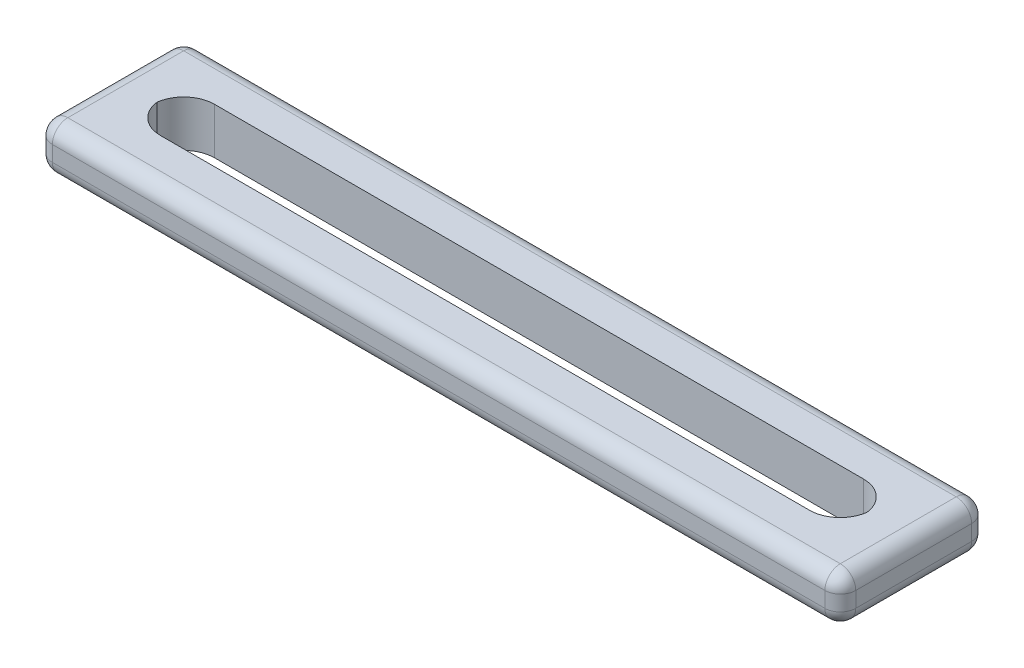
ISO-10303-21;
HEADER;
FILE_DESCRIPTION(('STEP AP214'),'2;1');
FILE_NAME('part.step','',(''),(''),'','','');
FILE_SCHEMA(('AUTOMOTIVE_DESIGN { 1 0 10303 214 1 1 1 1 }'));
ENDSEC;
DATA;
#1=APPLICATION_CONTEXT('core data for automotive mechanical design processes');
#2=APPLICATION_PROTOCOL_DEFINITION('international standard','automotive_design',2000,#1);
#3=PRODUCT_CONTEXT('',#1,'mechanical');
#4=PRODUCT('Part','Part','',(#3));
#5=PRODUCT_RELATED_PRODUCT_CATEGORY('part','',(#4));
#6=PRODUCT_DEFINITION_FORMATION('','',#4);
#7=PRODUCT_DEFINITION_CONTEXT('part definition',#1,'design');
#8=PRODUCT_DEFINITION('design','',#6,#7);
#9=PRODUCT_DEFINITION_SHAPE('','',#8);
#10=(LENGTH_UNIT() NAMED_UNIT(*) SI_UNIT(.MILLI.,.METRE.));
#11=(NAMED_UNIT(*) PLANE_ANGLE_UNIT() SI_UNIT($,.RADIAN.));
#12=(NAMED_UNIT(*) SI_UNIT($,.STERADIAN.) SOLID_ANGLE_UNIT());
#13=UNCERTAINTY_MEASURE_WITH_UNIT(LENGTH_MEASURE(1.E-05),#10,'distance_accuracy_value','');
#14=(GEOMETRIC_REPRESENTATION_CONTEXT(3) GLOBAL_UNCERTAINTY_ASSIGNED_CONTEXT((#13)) GLOBAL_UNIT_ASSIGNED_CONTEXT((#10,
#11,#12)) REPRESENTATION_CONTEXT('',''));
#15=CARTESIAN_POINT('',(0.,0.,0.));
#16=DIRECTION('',(0.,0.,1.));
#17=DIRECTION('',(1.,0.,0.));
#18=AXIS2_PLACEMENT_3D('',#15,#16,#17);
#19=CARTESIAN_POINT('',(0.,3.,0.));
#20=DIRECTION('',(0.,1.,0.));
#21=DIRECTION('',(0.,0.,1.));
#22=AXIS2_PLACEMENT_3D('',#19,#20,#21);
#23=PLANE('',#22);
#24=DIRECTION('',(1.,0.,0.));
#25=VECTOR('',#24,1.);
#26=CARTESIAN_POINT('',(36.3970997685735,3.,13.7310486902528));
#27=LINE('',#26,#25);
#28=CARTESIAN_POINT('',(-14.6029002314265,3.,13.7310486902528));
#29=VERTEX_POINT('',#28);
#30=CARTESIAN_POINT('',(35.3970997685735,3.,13.7310486902528));
#31=VERTEX_POINT('',#30);
#32=EDGE_CURVE('E241',#29,#31,#27,.T.);
#33=ORIENTED_EDGE('',*,*,#32,.T.);
#34=DIRECTION('',(0.,0.,-1.));
#35=VECTOR('',#34,1.);
#36=CARTESIAN_POINT('',(35.3970997685735,3.,5.23104869025281));
#37=LINE('',#36,#35);
#38=CARTESIAN_POINT('',(35.3970997685735,3.,6.23104869025281));
#39=VERTEX_POINT('',#38);
#40=EDGE_CURVE('E244',#31,#39,#37,.T.);
#41=ORIENTED_EDGE('',*,*,#40,.T.);
#42=DIRECTION('',(-1.,0.,0.));
#43=VECTOR('',#42,1.);
#44=CARTESIAN_POINT('',(-15.6029002314265,3.,6.23104869025282));
#45=LINE('',#44,#43);
#46=CARTESIAN_POINT('',(-14.6029002314265,3.,6.23104869025282));
#47=VERTEX_POINT('',#46);
#48=EDGE_CURVE('E229',#39,#47,#45,.T.);
#49=ORIENTED_EDGE('',*,*,#48,.T.);
#50=DIRECTION('',(0.,0.,1.));
#51=VECTOR('',#50,1.);
#52=CARTESIAN_POINT('',(-14.6029002314265,3.,14.7310486902528));
#53=LINE('',#52,#51);
#54=EDGE_CURVE('E238',#47,#29,#53,.T.);
#55=ORIENTED_EDGE('',*,*,#54,.T.);
#56=EDGE_LOOP('',(#33,#41,#49,#55));
#57=FACE_BOUND('',#56,.T.);
#58=CARTESIAN_POINT('',(-10.6029002314265,3.,9.73104869025281));
#59=DIRECTION('',(0.,1.,0.));
#60=DIRECTION('',(0.,0.,1.));
#61=AXIS2_PLACEMENT_3D('',#58,#59,#60);
#62=CIRCLE('',#61,2.);
#63=CARTESIAN_POINT('',(-10.6029002314265,3.,11.7310486902528));
#64=VERTEX_POINT('',#63);
#65=CARTESIAN_POINT('',(-12.5872137147249,3.,9.98104869025281));
#66=VERTEX_POINT('',#65);
#67=EDGE_CURVE('E177',#64,#66,#62,.F.);
#68=ORIENTED_EDGE('',*,*,#67,.T.);
#69=CARTESIAN_POINT('',(-10.6029002314265,3.,10.2310486902528));
#70=DIRECTION('',(0.,1.,0.));
#71=DIRECTION('',(0.,0.,1.));
#72=AXIS2_PLACEMENT_3D('',#69,#70,#71);
#73=CIRCLE('',#72,2.);
#74=CARTESIAN_POINT('',(-10.6029002314265,3.,8.23104869025281));
#75=VERTEX_POINT('',#74);
#76=EDGE_CURVE('E226',#66,#75,#73,.F.);
#77=ORIENTED_EDGE('',*,*,#76,.T.);
#78=DIRECTION('',(-1.,0.,0.));
#79=VECTOR('',#78,1.);
#80=CARTESIAN_POINT('',(-12.6029002314265,3.,8.23104869025281));
#81=LINE('',#80,#79);
#82=CARTESIAN_POINT('',(31.3970997685735,3.,8.23104869025282));
#83=VERTEX_POINT('',#82);
#84=EDGE_CURVE('E195',#83,#75,#81,.T.);
#85=ORIENTED_EDGE('',*,*,#84,.F.);
#86=CARTESIAN_POINT('',(31.3970997685735,3.,10.2310486902528));
#87=DIRECTION('',(0.,1.,0.));
#88=DIRECTION('',(0.,0.,1.));
#89=AXIS2_PLACEMENT_3D('',#86,#87,#88);
#90=CIRCLE('',#89,2.);
#91=CARTESIAN_POINT('',(33.3814132518719,3.,9.98104869025282));
#92=VERTEX_POINT('',#91);
#93=EDGE_CURVE('E178',#83,#92,#90,.F.);
#94=ORIENTED_EDGE('',*,*,#93,.T.);
#95=CARTESIAN_POINT('',(31.3970997685735,3.,9.73104869025281));
#96=DIRECTION('',(0.,1.,0.));
#97=DIRECTION('',(0.,0.,1.));
#98=AXIS2_PLACEMENT_3D('',#95,#96,#97);
#99=CIRCLE('',#98,2.);
#100=CARTESIAN_POINT('',(31.3970997685735,3.,11.7310486902528));
#101=VERTEX_POINT('',#100);
#102=EDGE_CURVE('E214',#92,#101,#99,.F.);
#103=ORIENTED_EDGE('',*,*,#102,.T.);
#104=DIRECTION('',(1.,0.,0.));
#105=VECTOR('',#104,1.);
#106=CARTESIAN_POINT('',(-12.6029002314265,3.,11.7310486902528));
#107=LINE('',#106,#105);
#108=EDGE_CURVE('E202',#64,#101,#107,.T.);
#109=ORIENTED_EDGE('',*,*,#108,.F.);
#110=EDGE_LOOP('',(#68,#77,#85,#94,#103,#109));
#111=FACE_BOUND('',#110,.T.);
#112=ADVANCED_FACE('F39',(#57,#111),#23,.T.);
#113=CARTESIAN_POINT('',(0.,0.,0.));
#114=DIRECTION('',(0.,1.,0.));
#115=DIRECTION('',(0.,0.,1.));
#116=AXIS2_PLACEMENT_3D('',#113,#114,#115);
#117=PLANE('',#116);
#118=DIRECTION('',(-1.,0.,0.));
#119=VECTOR('',#118,1.);
#120=CARTESIAN_POINT('',(0.,0.,6.23104869025282));
#121=LINE('',#120,#119);
#122=CARTESIAN_POINT('',(-14.6029002314265,0.,6.23104869025282));
#123=VERTEX_POINT('',#122);
#124=CARTESIAN_POINT('',(35.3970997685735,0.,6.23104869025281));
#125=VERTEX_POINT('',#124);
#126=EDGE_CURVE('E261',#123,#125,#121,.F.);
#127=ORIENTED_EDGE('',*,*,#126,.T.);
#128=DIRECTION('',(0.,0.,-1.));
#129=VECTOR('',#128,1.);
#130=CARTESIAN_POINT('',(35.3970997685735,0.,0.));
#131=LINE('',#130,#129);
#132=CARTESIAN_POINT('',(35.3970997685735,0.,13.7310486902528));
#133=VERTEX_POINT('',#132);
#134=EDGE_CURVE('E270',#125,#133,#131,.F.);
#135=ORIENTED_EDGE('',*,*,#134,.T.);
#136=DIRECTION('',(1.,0.,0.));
#137=VECTOR('',#136,1.);
#138=CARTESIAN_POINT('',(0.,0.,13.7310486902528));
#139=LINE('',#138,#137);
#140=CARTESIAN_POINT('',(-14.6029002314265,0.,13.7310486902528));
#141=VERTEX_POINT('',#140);
#142=EDGE_CURVE('E267',#133,#141,#139,.F.);
#143=ORIENTED_EDGE('',*,*,#142,.T.);
#144=DIRECTION('',(0.,0.,1.));
#145=VECTOR('',#144,1.);
#146=CARTESIAN_POINT('',(-14.6029002314265,0.,0.));
#147=LINE('',#146,#145);
#148=EDGE_CURVE('E264',#141,#123,#147,.F.);
#149=ORIENTED_EDGE('',*,*,#148,.T.);
#150=EDGE_LOOP('',(#127,#135,#143,#149));
#151=FACE_BOUND('',#150,.T.);
#152=DIRECTION('',(-1.,0.,0.));
#153=VECTOR('',#152,1.);
#154=CARTESIAN_POINT('',(-12.6029002314265,0.,8.23104869025281));
#155=LINE('',#154,#153);
#156=CARTESIAN_POINT('',(31.3970997685735,0.,8.23104869025282));
#157=VERTEX_POINT('',#156);
#158=CARTESIAN_POINT('',(-10.6029002314265,0.,8.23104869025281));
#159=VERTEX_POINT('',#158);
#160=EDGE_CURVE('E190',#157,#159,#155,.T.);
#161=ORIENTED_EDGE('',*,*,#160,.T.);
#162=CARTESIAN_POINT('',(-10.6029002314265,0.,10.2310486902528));
#163=DIRECTION('',(0.,1.,0.));
#164=DIRECTION('',(0.,0.,1.));
#165=AXIS2_PLACEMENT_3D('',#162,#163,#164);
#166=CIRCLE('',#165,2.);
#167=CARTESIAN_POINT('',(-12.5872137147249,0.,9.98104869025281));
#168=VERTEX_POINT('',#167);
#169=EDGE_CURVE('E171',#159,#168,#166,.T.);
#170=ORIENTED_EDGE('',*,*,#169,.T.);
#171=CARTESIAN_POINT('',(-10.6029002314265,0.,9.73104869025281));
#172=DIRECTION('',(0.,1.,0.));
#173=DIRECTION('',(0.,0.,1.));
#174=AXIS2_PLACEMENT_3D('',#171,#172,#173);
#175=CIRCLE('',#174,2.);
#176=CARTESIAN_POINT('',(-10.6029002314265,0.,11.7310486902528));
#177=VERTEX_POINT('',#176);
#178=EDGE_CURVE('E165',#168,#177,#175,.T.);
#179=ORIENTED_EDGE('',*,*,#178,.T.);
#180=DIRECTION('',(1.,0.,0.));
#181=VECTOR('',#180,1.);
#182=CARTESIAN_POINT('',(-12.6029002314265,0.,11.7310486902528));
#183=LINE('',#182,#181);
#184=CARTESIAN_POINT('',(31.3970997685735,0.,11.7310486902528));
#185=VERTEX_POINT('',#184);
#186=EDGE_CURVE('E169',#177,#185,#183,.T.);
#187=ORIENTED_EDGE('',*,*,#186,.T.);
#188=CARTESIAN_POINT('',(31.3970997685735,0.,9.73104869025281));
#189=DIRECTION('',(0.,1.,0.));
#190=DIRECTION('',(0.,0.,1.));
#191=AXIS2_PLACEMENT_3D('',#188,#189,#190);
#192=CIRCLE('',#191,2.);
#193=CARTESIAN_POINT('',(33.3814132518719,0.,9.98104869025282));
#194=VERTEX_POINT('',#193);
#195=EDGE_CURVE('E211',#185,#194,#192,.T.);
#196=ORIENTED_EDGE('',*,*,#195,.T.);
#197=CARTESIAN_POINT('',(31.3970997685735,0.,10.2310486902528));
#198=DIRECTION('',(0.,1.,0.));
#199=DIRECTION('',(0.,0.,1.));
#200=AXIS2_PLACEMENT_3D('',#197,#198,#199);
#201=CIRCLE('',#200,2.);
#202=EDGE_CURVE('E217',#194,#157,#201,.T.);
#203=ORIENTED_EDGE('',*,*,#202,.T.);
#204=EDGE_LOOP('',(#161,#170,#179,#187,#196,#203));
#205=FACE_BOUND('',#204,.T.);
#206=ADVANCED_FACE('F168',(#151,#205),#117,.F.);
#207=CARTESIAN_POINT('',(-15.6029002314265,3.,5.23104869025282));
#208=DIRECTION('',(1.,0.,0.));
#209=DIRECTION('',(0.,0.,-1.));
#210=AXIS2_PLACEMENT_3D('',#207,#208,#209);
#211=PLANE('',#210);
#212=DIRECTION('',(0.,-1.,0.));
#213=VECTOR('',#212,1.);
#214=CARTESIAN_POINT('',(-15.6029002314265,3.,13.7310486902528));
#215=LINE('',#214,#213);
#216=CARTESIAN_POINT('',(-15.6029002314265,1.,13.7310486902528));
#217=VERTEX_POINT('',#216);
#218=CARTESIAN_POINT('',(-15.6029002314265,2.,13.7310486902528));
#219=VERTEX_POINT('',#218);
#220=EDGE_CURVE('E293',#217,#219,#215,.F.);
#221=ORIENTED_EDGE('',*,*,#220,.T.);
#222=DIRECTION('',(0.,0.,1.));
#223=VECTOR('',#222,1.);
#224=CARTESIAN_POINT('',(-15.6029002314265,2.,5.23104869025282));
#225=LINE('',#224,#223);
#226=CARTESIAN_POINT('',(-15.6029002314265,2.,6.23104869025282));
#227=VERTEX_POINT('',#226);
#228=EDGE_CURVE('E296',#219,#227,#225,.F.);
#229=ORIENTED_EDGE('',*,*,#228,.T.);
#230=DIRECTION('',(0.,-1.,0.));
#231=VECTOR('',#230,1.);
#232=CARTESIAN_POINT('',(-15.6029002314265,3.,6.23104869025282));
#233=LINE('',#232,#231);
#234=CARTESIAN_POINT('',(-15.6029002314265,1.,6.23104869025282));
#235=VERTEX_POINT('',#234);
#236=EDGE_CURVE('E287',#227,#235,#233,.T.);
#237=ORIENTED_EDGE('',*,*,#236,.T.);
#238=DIRECTION('',(0.,0.,1.));
#239=VECTOR('',#238,1.);
#240=CARTESIAN_POINT('',(-15.6029002314265,1.,5.23104869025282));
#241=LINE('',#240,#239);
#242=EDGE_CURVE('E290',#235,#217,#241,.T.);
#243=ORIENTED_EDGE('',*,*,#242,.T.);
#244=EDGE_LOOP('',(#221,#229,#237,#243));
#245=FACE_BOUND('',#244,.T.);
#246=ADVANCED_FACE('F422',(#245),#211,.F.);
#247=CARTESIAN_POINT('',(-15.6029002314265,3.,14.7310486902528));
#248=DIRECTION('',(0.,0.,-1.));
#249=DIRECTION('',(-1.,0.,0.));
#250=AXIS2_PLACEMENT_3D('',#247,#248,#249);
#251=PLANE('',#250);
#252=DIRECTION('',(0.,-1.,0.));
#253=VECTOR('',#252,1.);
#254=CARTESIAN_POINT('',(35.3970997685735,3.,14.7310486902528));
#255=LINE('',#254,#253);
#256=CARTESIAN_POINT('',(35.3970997685735,1.,14.7310486902528));
#257=VERTEX_POINT('',#256);
#258=CARTESIAN_POINT('',(35.3970997685735,2.,14.7310486902528));
#259=VERTEX_POINT('',#258);
#260=EDGE_CURVE('E280',#257,#259,#255,.F.);
#261=ORIENTED_EDGE('',*,*,#260,.T.);
#262=DIRECTION('',(1.,0.,0.));
#263=VECTOR('',#262,1.);
#264=CARTESIAN_POINT('',(-15.6029002314265,2.,14.7310486902528));
#265=LINE('',#264,#263);
#266=CARTESIAN_POINT('',(-14.6029002314265,2.,14.7310486902528));
#267=VERTEX_POINT('',#266);
#268=EDGE_CURVE('E283',#259,#267,#265,.F.);
#269=ORIENTED_EDGE('',*,*,#268,.T.);
#270=DIRECTION('',(0.,-1.,0.));
#271=VECTOR('',#270,1.);
#272=CARTESIAN_POINT('',(-14.6029002314265,3.,14.7310486902528));
#273=LINE('',#272,#271);
#274=CARTESIAN_POINT('',(-14.6029002314265,1.,14.7310486902528));
#275=VERTEX_POINT('',#274);
#276=EDGE_CURVE('E274',#267,#275,#273,.T.);
#277=ORIENTED_EDGE('',*,*,#276,.T.);
#278=DIRECTION('',(1.,0.,0.));
#279=VECTOR('',#278,1.);
#280=CARTESIAN_POINT('',(-15.6029002314265,1.,14.7310486902528));
#281=LINE('',#280,#279);
#282=EDGE_CURVE('E277',#275,#257,#281,.T.);
#283=ORIENTED_EDGE('',*,*,#282,.T.);
#284=EDGE_LOOP('',(#261,#269,#277,#283));
#285=FACE_BOUND('',#284,.T.);
#286=ADVANCED_FACE('F413',(#285),#251,.F.);
#287=CARTESIAN_POINT('',(36.3970997685735,3.,5.23104869025281));
#288=DIRECTION('',(-1.,0.,0.));
#289=DIRECTION('',(0.,0.,1.));
#290=AXIS2_PLACEMENT_3D('',#287,#288,#289);
#291=PLANE('',#290);
#292=DIRECTION('',(0.,0.,-1.));
#293=VECTOR('',#292,1.);
#294=CARTESIAN_POINT('',(36.3970997685735,2.,14.7310486902528));
#295=LINE('',#294,#293);
#296=CARTESIAN_POINT('',(36.3970997685735,2.,6.23104869025281));
#297=VERTEX_POINT('',#296);
#298=CARTESIAN_POINT('',(36.3970997685735,2.,13.7310486902528));
#299=VERTEX_POINT('',#298);
#300=EDGE_CURVE('E254',#297,#299,#295,.F.);
#301=ORIENTED_EDGE('',*,*,#300,.T.);
#302=DIRECTION('',(0.,-1.,0.));
#303=VECTOR('',#302,1.);
#304=CARTESIAN_POINT('',(36.3970997685735,3.,13.7310486902528));
#305=LINE('',#304,#303);
#306=CARTESIAN_POINT('',(36.3970997685735,1.,13.7310486902528));
#307=VERTEX_POINT('',#306);
#308=EDGE_CURVE('E258',#299,#307,#305,.T.);
#309=ORIENTED_EDGE('',*,*,#308,.T.);
#310=DIRECTION('',(0.,0.,-1.));
#311=VECTOR('',#310,1.);
#312=CARTESIAN_POINT('',(36.3970997685735,1.,5.23104869025281));
#313=LINE('',#312,#311);
#314=CARTESIAN_POINT('',(36.3970997685735,1.,6.23104869025281));
#315=VERTEX_POINT('',#314);
#316=EDGE_CURVE('E251',#307,#315,#313,.T.);
#317=ORIENTED_EDGE('',*,*,#316,.T.);
#318=DIRECTION('',(0.,-1.,0.));
#319=VECTOR('',#318,1.);
#320=CARTESIAN_POINT('',(36.3970997685735,3.,6.23104869025281));
#321=LINE('',#320,#319);
#322=EDGE_CURVE('E248',#315,#297,#321,.F.);
#323=ORIENTED_EDGE('',*,*,#322,.T.);
#324=EDGE_LOOP('',(#301,#309,#317,#323));
#325=FACE_BOUND('',#324,.T.);
#326=ADVANCED_FACE('F488',(#325),#291,.F.);
#327=CARTESIAN_POINT('',(-15.6029002314265,3.,5.23104869025282));
#328=DIRECTION('',(0.,0.,1.));
#329=DIRECTION('',(1.,0.,0.));
#330=AXIS2_PLACEMENT_3D('',#327,#328,#329);
#331=PLANE('',#330);
#332=DIRECTION('',(-1.,0.,0.));
#333=VECTOR('',#332,1.);
#334=CARTESIAN_POINT('',(36.3970997685735,2.,5.23104869025281));
#335=LINE('',#334,#333);
#336=CARTESIAN_POINT('',(-14.6029002314265,2.,5.23104869025282));
#337=VERTEX_POINT('',#336);
#338=CARTESIAN_POINT('',(35.3970997685735,2.,5.23104869025281));
#339=VERTEX_POINT('',#338);
#340=EDGE_CURVE('E49',#337,#339,#335,.F.);
#341=ORIENTED_EDGE('',*,*,#340,.T.);
#342=DIRECTION('',(0.,-1.,0.));
#343=VECTOR('',#342,1.);
#344=CARTESIAN_POINT('',(35.3970997685735,3.,5.23104869025281));
#345=LINE('',#344,#343);
#346=CARTESIAN_POINT('',(35.3970997685735,1.,5.23104869025281));
#347=VERTEX_POINT('',#346);
#348=EDGE_CURVE('E11',#339,#347,#345,.T.);
#349=ORIENTED_EDGE('',*,*,#348,.T.);
#350=DIRECTION('',(-1.,0.,0.));
#351=VECTOR('',#350,1.);
#352=CARTESIAN_POINT('',(-15.6029002314265,1.,5.23104869025282));
#353=LINE('',#352,#351);
#354=CARTESIAN_POINT('',(-14.6029002314265,1.,5.23104869025282));
#355=VERTEX_POINT('',#354);
#356=EDGE_CURVE('E300',#347,#355,#353,.T.);
#357=ORIENTED_EDGE('',*,*,#356,.T.);
#358=DIRECTION('',(0.,-1.,0.));
#359=VECTOR('',#358,1.);
#360=CARTESIAN_POINT('',(-14.6029002314265,3.,5.23104869025282));
#361=LINE('',#360,#359);
#362=EDGE_CURVE('E60',#355,#337,#361,.F.);
#363=ORIENTED_EDGE('',*,*,#362,.T.);
#364=EDGE_LOOP('',(#341,#349,#357,#363));
#365=FACE_BOUND('',#364,.T.);
#366=ADVANCED_FACE('F485',(#365),#331,.F.);
#367=CARTESIAN_POINT('',(-12.6029002314265,3.,11.7310486902528));
#368=DIRECTION('',(0.,0.,-1.));
#369=DIRECTION('',(-1.,0.,0.));
#370=AXIS2_PLACEMENT_3D('',#367,#368,#369);
#371=PLANE('',#370);
#372=ORIENTED_EDGE('',*,*,#108,.T.);
#373=DIRECTION('',(0.,-1.,0.));
#374=VECTOR('',#373,1.);
#375=CARTESIAN_POINT('',(31.3970997685735,0.,11.7310486902528));
#376=LINE('',#375,#374);
#377=EDGE_CURVE('E188',#101,#185,#376,.T.);
#378=ORIENTED_EDGE('',*,*,#377,.T.);
#379=ORIENTED_EDGE('',*,*,#186,.F.);
#380=DIRECTION('',(0.,-1.,0.));
#381=VECTOR('',#380,1.);
#382=CARTESIAN_POINT('',(-10.6029002314265,3.,11.7310486902528));
#383=LINE('',#382,#381);
#384=EDGE_CURVE('E185',#177,#64,#383,.F.);
#385=ORIENTED_EDGE('',*,*,#384,.T.);
#386=EDGE_LOOP('',(#372,#378,#379,#385));
#387=FACE_BOUND('',#386,.T.);
#388=ADVANCED_FACE('F184',(#387),#371,.T.);
#389=CARTESIAN_POINT('',(-12.6029002314265,3.,8.23104869025281));
#390=DIRECTION('',(0.,0.,1.));
#391=DIRECTION('',(1.,0.,0.));
#392=AXIS2_PLACEMENT_3D('',#389,#390,#391);
#393=PLANE('',#392);
#394=ORIENTED_EDGE('',*,*,#160,.F.);
#395=DIRECTION('',(0.,-1.,0.));
#396=VECTOR('',#395,1.);
#397=CARTESIAN_POINT('',(31.3970997685735,3.,8.23104869025282));
#398=LINE('',#397,#396);
#399=EDGE_CURVE('E208',#157,#83,#398,.F.);
#400=ORIENTED_EDGE('',*,*,#399,.T.);
#401=ORIENTED_EDGE('',*,*,#84,.T.);
#402=DIRECTION('',(0.,-1.,0.));
#403=VECTOR('',#402,1.);
#404=CARTESIAN_POINT('',(-10.6029002314265,0.,8.23104869025281));
#405=LINE('',#404,#403);
#406=EDGE_CURVE('E199',#75,#159,#405,.T.);
#407=ORIENTED_EDGE('',*,*,#406,.T.);
#408=EDGE_LOOP('',(#394,#400,#401,#407));
#409=FACE_BOUND('',#408,.T.);
#410=ADVANCED_FACE('F504',(#409),#393,.T.);
#411=CARTESIAN_POINT('',(31.3970997685735,3.,10.2310486902528));
#412=DIRECTION('',(0.,1.,0.));
#413=DIRECTION('',(0.,0.,1.));
#414=AXIS2_PLACEMENT_3D('',#411,#412,#413);
#415=CYLINDRICAL_SURFACE('',#414,2.);
#416=DIRECTION('',(0.,1.,0.));
#417=VECTOR('',#416,1.);
#418=CARTESIAN_POINT('',(33.3814132518719,1.5,9.98104869025282));
#419=LINE('',#418,#417);
#420=EDGE_CURVE('E191',#92,#194,#419,.F.);
#421=ORIENTED_EDGE('',*,*,#420,.F.);
#422=ORIENTED_EDGE('',*,*,#93,.F.);
#423=ORIENTED_EDGE('',*,*,#399,.F.);
#424=ORIENTED_EDGE('',*,*,#202,.F.);
#425=EDGE_LOOP('',(#421,#422,#423,#424));
#426=FACE_BOUND('',#425,.T.);
#427=ADVANCED_FACE('F500',(#426),#415,.F.);
#428=CARTESIAN_POINT('',(31.3970997685735,3.,9.73104869025281));
#429=DIRECTION('',(0.,1.,0.));
#430=DIRECTION('',(0.,0.,1.));
#431=AXIS2_PLACEMENT_3D('',#428,#429,#430);
#432=CYLINDRICAL_SURFACE('',#431,2.);
#433=ORIENTED_EDGE('',*,*,#102,.F.);
#434=ORIENTED_EDGE('',*,*,#420,.T.);
#435=ORIENTED_EDGE('',*,*,#195,.F.);
#436=ORIENTED_EDGE('',*,*,#377,.F.);
#437=EDGE_LOOP('',(#433,#434,#435,#436));
#438=FACE_BOUND('',#437,.T.);
#439=ADVANCED_FACE('F496',(#438),#432,.F.);
#440=CARTESIAN_POINT('',(-10.6029002314265,3.,10.2310486902528));
#441=DIRECTION('',(0.,1.,0.));
#442=DIRECTION('',(0.,0.,1.));
#443=AXIS2_PLACEMENT_3D('',#440,#441,#442);
#444=CYLINDRICAL_SURFACE('',#443,2.);
#445=ORIENTED_EDGE('',*,*,#406,.F.);
#446=ORIENTED_EDGE('',*,*,#76,.F.);
#447=DIRECTION('',(0.,1.,0.));
#448=VECTOR('',#447,1.);
#449=CARTESIAN_POINT('',(-12.5872137147249,1.5,9.98104869025281));
#450=LINE('',#449,#448);
#451=EDGE_CURVE('E233',#168,#66,#450,.T.);
#452=ORIENTED_EDGE('',*,*,#451,.F.);
#453=ORIENTED_EDGE('',*,*,#169,.F.);
#454=EDGE_LOOP('',(#445,#446,#452,#453));
#455=FACE_BOUND('',#454,.T.);
#456=ADVANCED_FACE('F499',(#455),#444,.F.);
#457=CARTESIAN_POINT('',(-10.6029002314265,3.,9.73104869025281));
#458=DIRECTION('',(0.,1.,0.));
#459=DIRECTION('',(0.,0.,1.));
#460=AXIS2_PLACEMENT_3D('',#457,#458,#459);
#461=CYLINDRICAL_SURFACE('',#460,2.);
#462=ORIENTED_EDGE('',*,*,#67,.F.);
#463=ORIENTED_EDGE('',*,*,#384,.F.);
#464=ORIENTED_EDGE('',*,*,#178,.F.);
#465=ORIENTED_EDGE('',*,*,#451,.T.);
#466=EDGE_LOOP('',(#462,#463,#464,#465));
#467=FACE_BOUND('',#466,.T.);
#468=ADVANCED_FACE('F193',(#467),#461,.F.);
#469=CARTESIAN_POINT('',(-14.6029002314265,1.,5.23104869025282));
#470=DIRECTION('',(0.,0.,1.));
#471=DIRECTION('',(1.,0.,0.));
#472=AXIS2_PLACEMENT_3D('',#469,#470,#471);
#473=CYLINDRICAL_SURFACE('',#472,1.);
#474=CARTESIAN_POINT('',(-14.6029002314265,1.,13.7310486902528));
#475=DIRECTION('',(0.,0.,1.));
#476=DIRECTION('',(1.,0.,0.));
#477=AXIS2_PLACEMENT_3D('',#474,#475,#476);
#478=CIRCLE('',#477,1.);
#479=EDGE_CURVE('E43',#217,#141,#478,.T.);
#480=ORIENTED_EDGE('',*,*,#479,.F.);
#481=ORIENTED_EDGE('',*,*,#242,.F.);
#482=CARTESIAN_POINT('',(-14.6029002314265,1.,6.23104869025282));
#483=DIRECTION('',(0.,0.,-1.));
#484=DIRECTION('',(-1.,0.,0.));
#485=AXIS2_PLACEMENT_3D('',#482,#483,#484);
#486=CIRCLE('',#485,1.);
#487=EDGE_CURVE('E388',#123,#235,#486,.T.);
#488=ORIENTED_EDGE('',*,*,#487,.F.);
#489=ORIENTED_EDGE('',*,*,#148,.F.);
#490=EDGE_LOOP('',(#480,#481,#488,#489));
#491=FACE_BOUND('',#490,.T.);
#492=ADVANCED_FACE('F41',(#491),#473,.T.);
#493=CARTESIAN_POINT('',(-14.6029002314265,1.,13.7310486902528));
#494=DIRECTION('',(0.,0.,1.));
#495=DIRECTION('',(1.,0.,0.));
#496=AXIS2_PLACEMENT_3D('',#493,#494,#495);
#497=SPHERICAL_SURFACE('',#496,1.);
#498=CARTESIAN_POINT('',(-14.6029002314265,1.,13.7310486902528));
#499=DIRECTION('',(0.,-1.,0.));
#500=DIRECTION('',(0.,0.,-1.));
#501=AXIS2_PLACEMENT_3D('',#498,#499,#500);
#502=CIRCLE('',#501,1.);
#503=EDGE_CURVE('E381',#217,#275,#502,.F.);
#504=ORIENTED_EDGE('',*,*,#503,.F.);
#505=ORIENTED_EDGE('',*,*,#479,.T.);
#506=CARTESIAN_POINT('',(-14.6029002314265,1.,13.7310486902528));
#507=DIRECTION('',(-1.,0.,0.));
#508=DIRECTION('',(0.,0.,1.));
#509=AXIS2_PLACEMENT_3D('',#506,#507,#508);
#510=CIRCLE('',#509,1.);
#511=EDGE_CURVE('E385',#275,#141,#510,.F.);
#512=ORIENTED_EDGE('',*,*,#511,.F.);
#513=EDGE_LOOP('',(#504,#505,#512));
#514=FACE_BOUND('',#513,.T.);
#515=ADVANCED_FACE('F401',(#514),#497,.T.);
#516=CARTESIAN_POINT('',(-14.6029002314265,1.,6.23104869025282));
#517=DIRECTION('',(0.,0.,1.));
#518=DIRECTION('',(1.,0.,0.));
#519=AXIS2_PLACEMENT_3D('',#516,#517,#518);
#520=SPHERICAL_SURFACE('',#519,1.);
#521=CARTESIAN_POINT('',(-14.6029002314265,1.,6.23104869025282));
#522=DIRECTION('',(-1.,0.,0.));
#523=DIRECTION('',(0.,0.,1.));
#524=AXIS2_PLACEMENT_3D('',#521,#522,#523);
#525=CIRCLE('',#524,1.);
#526=EDGE_CURVE('E373',#123,#355,#525,.F.);
#527=ORIENTED_EDGE('',*,*,#526,.F.);
#528=ORIENTED_EDGE('',*,*,#487,.T.);
#529=CARTESIAN_POINT('',(-14.6029002314265,1.,6.23104869025282));
#530=DIRECTION('',(0.,-1.,0.));
#531=DIRECTION('',(0.,0.,-1.));
#532=AXIS2_PLACEMENT_3D('',#529,#530,#531);
#533=CIRCLE('',#532,1.);
#534=EDGE_CURVE('E377',#355,#235,#533,.F.);
#535=ORIENTED_EDGE('',*,*,#534,.F.);
#536=EDGE_LOOP('',(#527,#528,#535));
#537=FACE_BOUND('',#536,.T.);
#538=ADVANCED_FACE('F435',(#537),#520,.T.);
#539=CARTESIAN_POINT('',(-15.6029002314265,1.,13.7310486902528));
#540=DIRECTION('',(1.,0.,0.));
#541=DIRECTION('',(0.,0.,-1.));
#542=AXIS2_PLACEMENT_3D('',#539,#540,#541);
#543=CYLINDRICAL_SURFACE('',#542,1.);
#544=ORIENTED_EDGE('',*,*,#511,.T.);
#545=ORIENTED_EDGE('',*,*,#142,.F.);
#546=CARTESIAN_POINT('',(35.3970997685735,1.,13.7310486902528));
#547=DIRECTION('',(1.,0.,0.));
#548=DIRECTION('',(0.,0.,-1.));
#549=AXIS2_PLACEMENT_3D('',#546,#547,#548);
#550=CIRCLE('',#549,1.);
#551=EDGE_CURVE('E366',#257,#133,#550,.T.);
#552=ORIENTED_EDGE('',*,*,#551,.F.);
#553=ORIENTED_EDGE('',*,*,#282,.F.);
#554=EDGE_LOOP('',(#544,#545,#552,#553));
#555=FACE_BOUND('',#554,.T.);
#556=ADVANCED_FACE('F409',(#555),#543,.T.);
#557=CARTESIAN_POINT('',(-14.6029002314265,3.,13.7310486902528));
#558=DIRECTION('',(0.,-1.,0.));
#559=DIRECTION('',(0.,0.,-1.));
#560=AXIS2_PLACEMENT_3D('',#557,#558,#559);
#561=CYLINDRICAL_SURFACE('',#560,1.);
#562=ORIENTED_EDGE('',*,*,#503,.T.);
#563=ORIENTED_EDGE('',*,*,#276,.F.);
#564=CARTESIAN_POINT('',(-14.6029002314265,2.,13.7310486902528));
#565=DIRECTION('',(0.,1.,0.));
#566=DIRECTION('',(0.,0.,1.));
#567=AXIS2_PLACEMENT_3D('',#564,#565,#566);
#568=CIRCLE('',#567,1.);
#569=EDGE_CURVE('E362',#219,#267,#568,.T.);
#570=ORIENTED_EDGE('',*,*,#569,.F.);
#571=ORIENTED_EDGE('',*,*,#220,.F.);
#572=EDGE_LOOP('',(#562,#563,#570,#571));
#573=FACE_BOUND('',#572,.T.);
#574=ADVANCED_FACE('F419',(#573),#561,.T.);
#575=CARTESIAN_POINT('',(-14.6029002314265,2.,0.));
#576=DIRECTION('',(0.,0.,-1.));
#577=DIRECTION('',(-1.,0.,0.));
#578=AXIS2_PLACEMENT_3D('',#575,#576,#577);
#579=CYLINDRICAL_SURFACE('',#578,1.);
#580=CARTESIAN_POINT('',(-14.6029002314265,2.,6.23104869025282));
#581=DIRECTION('',(0.,0.,-1.));
#582=DIRECTION('',(-1.,0.,0.));
#583=AXIS2_PLACEMENT_3D('',#580,#581,#582);
#584=CIRCLE('',#583,1.);
#585=EDGE_CURVE('E354',#227,#47,#584,.T.);
#586=ORIENTED_EDGE('',*,*,#585,.F.);
#587=ORIENTED_EDGE('',*,*,#228,.F.);
#588=CARTESIAN_POINT('',(-14.6029002314265,2.,13.7310486902528));
#589=DIRECTION('',(0.,0.,1.));
#590=DIRECTION('',(1.,0.,0.));
#591=AXIS2_PLACEMENT_3D('',#588,#589,#590);
#592=CIRCLE('',#591,1.);
#593=EDGE_CURVE('E358',#29,#219,#592,.T.);
#594=ORIENTED_EDGE('',*,*,#593,.F.);
#595=ORIENTED_EDGE('',*,*,#54,.F.);
#596=EDGE_LOOP('',(#586,#587,#594,#595));
#597=FACE_BOUND('',#596,.T.);
#598=ADVANCED_FACE('F426',(#597),#579,.T.);
#599=CARTESIAN_POINT('',(-14.6029002314265,3.,6.23104869025282));
#600=DIRECTION('',(0.,-1.,0.));
#601=DIRECTION('',(0.,0.,-1.));
#602=AXIS2_PLACEMENT_3D('',#599,#600,#601);
#603=CYLINDRICAL_SURFACE('',#602,1.);
#604=ORIENTED_EDGE('',*,*,#534,.T.);
#605=ORIENTED_EDGE('',*,*,#236,.F.);
#606=CARTESIAN_POINT('',(-14.6029002314265,2.,6.23104869025282));
#607=DIRECTION('',(0.,1.,0.));
#608=DIRECTION('',(0.,0.,1.));
#609=AXIS2_PLACEMENT_3D('',#606,#607,#608);
#610=CIRCLE('',#609,1.);
#611=EDGE_CURVE('E351',#337,#227,#610,.T.);
#612=ORIENTED_EDGE('',*,*,#611,.F.);
#613=ORIENTED_EDGE('',*,*,#362,.F.);
#614=EDGE_LOOP('',(#604,#605,#612,#613));
#615=FACE_BOUND('',#614,.T.);
#616=ADVANCED_FACE('F433',(#615),#603,.T.);
#617=CARTESIAN_POINT('',(-15.6029002314265,1.,6.23104869025282));
#618=DIRECTION('',(-1.,0.,0.));
#619=DIRECTION('',(0.,0.,1.));
#620=AXIS2_PLACEMENT_3D('',#617,#618,#619);
#621=CYLINDRICAL_SURFACE('',#620,1.);
#622=ORIENTED_EDGE('',*,*,#526,.T.);
#623=ORIENTED_EDGE('',*,*,#356,.F.);
#624=CARTESIAN_POINT('',(35.3970997685735,1.,6.23104869025281));
#625=DIRECTION('',(1.,0.,0.));
#626=DIRECTION('',(0.,0.,-1.));
#627=AXIS2_PLACEMENT_3D('',#624,#625,#626);
#628=CIRCLE('',#627,1.);
#629=EDGE_CURVE('E347',#125,#347,#628,.T.);
#630=ORIENTED_EDGE('',*,*,#629,.F.);
#631=ORIENTED_EDGE('',*,*,#126,.F.);
#632=EDGE_LOOP('',(#622,#623,#630,#631));
#633=FACE_BOUND('',#632,.T.);
#634=ADVANCED_FACE('F439',(#633),#621,.T.);
#635=CARTESIAN_POINT('',(35.3970997685735,1.,5.23104869025281));
#636=DIRECTION('',(0.,0.,-1.));
#637=DIRECTION('',(-1.,0.,0.));
#638=AXIS2_PLACEMENT_3D('',#635,#636,#637);
#639=CYLINDRICAL_SURFACE('',#638,1.);
#640=CARTESIAN_POINT('',(35.3970997685735,1.,13.7310486902528));
#641=DIRECTION('',(0.,0.,1.));
#642=DIRECTION('',(1.,0.,0.));
#643=AXIS2_PLACEMENT_3D('',#640,#641,#642);
#644=CIRCLE('',#643,1.);
#645=EDGE_CURVE('E369',#133,#307,#644,.T.);
#646=ORIENTED_EDGE('',*,*,#645,.F.);
#647=ORIENTED_EDGE('',*,*,#134,.F.);
#648=CARTESIAN_POINT('',(35.3970997685735,1.,6.23104869025281));
#649=DIRECTION('',(0.,0.,-1.));
#650=DIRECTION('',(-1.,0.,0.));
#651=AXIS2_PLACEMENT_3D('',#648,#649,#650);
#652=CIRCLE('',#651,1.);
#653=EDGE_CURVE('E343',#315,#125,#652,.T.);
#654=ORIENTED_EDGE('',*,*,#653,.F.);
#655=ORIENTED_EDGE('',*,*,#316,.F.);
#656=EDGE_LOOP('',(#646,#647,#654,#655));
#657=FACE_BOUND('',#656,.T.);
#658=ADVANCED_FACE('F445',(#657),#639,.T.);
#659=CARTESIAN_POINT('',(35.3970997685735,1.,13.7310486902528));
#660=DIRECTION('',(0.,0.,1.));
#661=DIRECTION('',(1.,0.,0.));
#662=AXIS2_PLACEMENT_3D('',#659,#660,#661);
#663=SPHERICAL_SURFACE('',#662,1.);
#664=ORIENTED_EDGE('',*,*,#551,.T.);
#665=ORIENTED_EDGE('',*,*,#645,.T.);
#666=CARTESIAN_POINT('',(35.3970997685735,1.,13.7310486902528));
#667=DIRECTION('',(0.,-1.,0.));
#668=DIRECTION('',(0.,0.,-1.));
#669=AXIS2_PLACEMENT_3D('',#666,#667,#668);
#670=CIRCLE('',#669,1.);
#671=EDGE_CURVE('E339',#257,#307,#670,.F.);
#672=ORIENTED_EDGE('',*,*,#671,.F.);
#673=EDGE_LOOP('',(#664,#665,#672));
#674=FACE_BOUND('',#673,.T.);
#675=ADVANCED_FACE('F449',(#674),#663,.T.);
#676=CARTESIAN_POINT('',(-14.6029002314265,2.,13.7310486902528));
#677=DIRECTION('',(0.,0.,1.));
#678=DIRECTION('',(1.,0.,0.));
#679=AXIS2_PLACEMENT_3D('',#676,#677,#678);
#680=SPHERICAL_SURFACE('',#679,1.);
#681=ORIENTED_EDGE('',*,*,#593,.T.);
#682=ORIENTED_EDGE('',*,*,#569,.T.);
#683=CARTESIAN_POINT('',(-14.6029002314265,2.,13.7310486902528));
#684=DIRECTION('',(-1.,0.,0.));
#685=DIRECTION('',(0.,0.,1.));
#686=AXIS2_PLACEMENT_3D('',#683,#684,#685);
#687=CIRCLE('',#686,1.);
#688=EDGE_CURVE('E336',#29,#267,#687,.F.);
#689=ORIENTED_EDGE('',*,*,#688,.F.);
#690=EDGE_LOOP('',(#681,#682,#689));
#691=FACE_BOUND('',#690,.T.);
#692=ADVANCED_FACE('F463',(#691),#680,.T.);
#693=CARTESIAN_POINT('',(-14.6029002314265,2.,6.23104869025282));
#694=DIRECTION('',(0.,0.,1.));
#695=DIRECTION('',(1.,0.,0.));
#696=AXIS2_PLACEMENT_3D('',#693,#694,#695);
#697=SPHERICAL_SURFACE('',#696,1.);
#698=ORIENTED_EDGE('',*,*,#611,.T.);
#699=ORIENTED_EDGE('',*,*,#585,.T.);
#700=CARTESIAN_POINT('',(-14.6029002314265,2.,6.23104869025282));
#701=DIRECTION('',(-1.,0.,0.));
#702=DIRECTION('',(0.,0.,1.));
#703=AXIS2_PLACEMENT_3D('',#700,#701,#702);
#704=CIRCLE('',#703,1.);
#705=EDGE_CURVE('E332',#337,#47,#704,.F.);
#706=ORIENTED_EDGE('',*,*,#705,.F.);
#707=EDGE_LOOP('',(#698,#699,#706));
#708=FACE_BOUND('',#707,.T.);
#709=ADVANCED_FACE('F465',(#708),#697,.T.);
#710=CARTESIAN_POINT('',(35.3970997685735,1.,6.23104869025281));
#711=DIRECTION('',(0.,0.,1.));
#712=DIRECTION('',(1.,0.,0.));
#713=AXIS2_PLACEMENT_3D('',#710,#711,#712);
#714=SPHERICAL_SURFACE('',#713,1.);
#715=ORIENTED_EDGE('',*,*,#653,.T.);
#716=ORIENTED_EDGE('',*,*,#629,.T.);
#717=CARTESIAN_POINT('',(35.3970997685735,1.,6.23104869025281));
#718=DIRECTION('',(0.,-1.,0.));
#719=DIRECTION('',(0.,0.,-1.));
#720=AXIS2_PLACEMENT_3D('',#717,#718,#719);
#721=CIRCLE('',#720,1.);
#722=EDGE_CURVE('E329',#315,#347,#721,.F.);
#723=ORIENTED_EDGE('',*,*,#722,.F.);
#724=EDGE_LOOP('',(#715,#716,#723));
#725=FACE_BOUND('',#724,.T.);
#726=ADVANCED_FACE('F471',(#725),#714,.T.);
#727=CARTESIAN_POINT('',(35.3970997685735,3.,13.7310486902528));
#728=DIRECTION('',(0.,-1.,0.));
#729=DIRECTION('',(0.,0.,-1.));
#730=AXIS2_PLACEMENT_3D('',#727,#728,#729);
#731=CYLINDRICAL_SURFACE('',#730,1.);
#732=ORIENTED_EDGE('',*,*,#671,.T.);
#733=ORIENTED_EDGE('',*,*,#308,.F.);
#734=CARTESIAN_POINT('',(35.3970997685735,2.,13.7310486902528));
#735=DIRECTION('',(0.,1.,0.));
#736=DIRECTION('',(0.,0.,1.));
#737=AXIS2_PLACEMENT_3D('',#734,#735,#736);
#738=CIRCLE('',#737,1.);
#739=EDGE_CURVE('E325',#259,#299,#738,.T.);
#740=ORIENTED_EDGE('',*,*,#739,.F.);
#741=ORIENTED_EDGE('',*,*,#260,.F.);
#742=EDGE_LOOP('',(#732,#733,#740,#741));
#743=FACE_BOUND('',#742,.T.);
#744=ADVANCED_FACE('F452',(#743),#731,.T.);
#745=CARTESIAN_POINT('',(0.,2.,13.7310486902528));
#746=DIRECTION('',(-1.,0.,0.));
#747=DIRECTION('',(0.,0.,1.));
#748=AXIS2_PLACEMENT_3D('',#745,#746,#747);
#749=CYLINDRICAL_SURFACE('',#748,1.);
#750=ORIENTED_EDGE('',*,*,#688,.T.);
#751=ORIENTED_EDGE('',*,*,#268,.F.);
#752=CARTESIAN_POINT('',(35.3970997685735,2.,13.7310486902528));
#753=DIRECTION('',(1.,0.,0.));
#754=DIRECTION('',(0.,0.,-1.));
#755=AXIS2_PLACEMENT_3D('',#752,#753,#754);
#756=CIRCLE('',#755,1.);
#757=EDGE_CURVE('E321',#31,#259,#756,.T.);
#758=ORIENTED_EDGE('',*,*,#757,.F.);
#759=ORIENTED_EDGE('',*,*,#32,.F.);
#760=EDGE_LOOP('',(#750,#751,#758,#759));
#761=FACE_BOUND('',#760,.T.);
#762=ADVANCED_FACE('F461',(#761),#749,.T.);
#763=CARTESIAN_POINT('',(0.,2.,6.23104869025282));
#764=DIRECTION('',(1.,0.,0.));
#765=DIRECTION('',(0.,0.,-1.));
#766=AXIS2_PLACEMENT_3D('',#763,#764,#765);
#767=CYLINDRICAL_SURFACE('',#766,1.);
#768=ORIENTED_EDGE('',*,*,#705,.T.);
#769=ORIENTED_EDGE('',*,*,#48,.F.);
#770=CARTESIAN_POINT('',(35.3970997685735,2.,6.23104869025281));
#771=DIRECTION('',(1.,0.,0.));
#772=DIRECTION('',(0.,0.,-1.));
#773=AXIS2_PLACEMENT_3D('',#770,#771,#772);
#774=CIRCLE('',#773,1.);
#775=EDGE_CURVE('E317',#339,#39,#774,.T.);
#776=ORIENTED_EDGE('',*,*,#775,.F.);
#777=ORIENTED_EDGE('',*,*,#340,.F.);
#778=EDGE_LOOP('',(#768,#769,#776,#777));
#779=FACE_BOUND('',#778,.T.);
#780=ADVANCED_FACE('F524',(#779),#767,.T.);
#781=CARTESIAN_POINT('',(35.3970997685735,3.,6.23104869025281));
#782=DIRECTION('',(0.,-1.,0.));
#783=DIRECTION('',(0.,0.,-1.));
#784=AXIS2_PLACEMENT_3D('',#781,#782,#783);
#785=CYLINDRICAL_SURFACE('',#784,1.);
#786=ORIENTED_EDGE('',*,*,#722,.T.);
#787=ORIENTED_EDGE('',*,*,#348,.F.);
#788=CARTESIAN_POINT('',(35.3970997685735,2.,6.23104869025281));
#789=DIRECTION('',(0.,1.,0.));
#790=DIRECTION('',(0.,0.,1.));
#791=AXIS2_PLACEMENT_3D('',#788,#789,#790);
#792=CIRCLE('',#791,1.);
#793=EDGE_CURVE('E313',#297,#339,#792,.T.);
#794=ORIENTED_EDGE('',*,*,#793,.F.);
#795=ORIENTED_EDGE('',*,*,#322,.F.);
#796=EDGE_LOOP('',(#786,#787,#794,#795));
#797=FACE_BOUND('',#796,.T.);
#798=ADVANCED_FACE('F521',(#797),#785,.T.);
#799=CARTESIAN_POINT('',(35.3970997685735,2.,13.7310486902528));
#800=DIRECTION('',(0.,0.,1.));
#801=DIRECTION('',(1.,0.,0.));
#802=AXIS2_PLACEMENT_3D('',#799,#800,#801);
#803=SPHERICAL_SURFACE('',#802,1.);
#804=ORIENTED_EDGE('',*,*,#757,.T.);
#805=ORIENTED_EDGE('',*,*,#739,.T.);
#806=CARTESIAN_POINT('',(35.3970997685735,2.,13.7310486902528));
#807=DIRECTION('',(0.,0.,1.));
#808=DIRECTION('',(1.,0.,0.));
#809=AXIS2_PLACEMENT_3D('',#806,#807,#808);
#810=CIRCLE('',#809,1.);
#811=EDGE_CURVE('E310',#31,#299,#810,.F.);
#812=ORIENTED_EDGE('',*,*,#811,.F.);
#813=EDGE_LOOP('',(#804,#805,#812));
#814=FACE_BOUND('',#813,.T.);
#815=ADVANCED_FACE('F457',(#814),#803,.T.);
#816=CARTESIAN_POINT('',(35.3970997685735,2.,6.23104869025281));
#817=DIRECTION('',(0.,0.,1.));
#818=DIRECTION('',(1.,0.,0.));
#819=AXIS2_PLACEMENT_3D('',#816,#817,#818);
#820=SPHERICAL_SURFACE('',#819,1.);
#821=ORIENTED_EDGE('',*,*,#793,.T.);
#822=ORIENTED_EDGE('',*,*,#775,.T.);
#823=CARTESIAN_POINT('',(35.3970997685735,2.,6.23104869025281));
#824=DIRECTION('',(0.,0.,-1.));
#825=DIRECTION('',(-1.,0.,0.));
#826=AXIS2_PLACEMENT_3D('',#823,#824,#825);
#827=CIRCLE('',#826,1.);
#828=EDGE_CURVE('E307',#297,#39,#827,.F.);
#829=ORIENTED_EDGE('',*,*,#828,.F.);
#830=EDGE_LOOP('',(#821,#822,#829));
#831=FACE_BOUND('',#830,.T.);
#832=ADVANCED_FACE('F514',(#831),#820,.T.);
#833=CARTESIAN_POINT('',(35.3970997685735,2.,0.));
#834=DIRECTION('',(0.,0.,1.));
#835=DIRECTION('',(1.,0.,0.));
#836=AXIS2_PLACEMENT_3D('',#833,#834,#835);
#837=CYLINDRICAL_SURFACE('',#836,1.);
#838=ORIENTED_EDGE('',*,*,#811,.T.);
#839=ORIENTED_EDGE('',*,*,#300,.F.);
#840=ORIENTED_EDGE('',*,*,#828,.T.);
#841=ORIENTED_EDGE('',*,*,#40,.F.);
#842=EDGE_LOOP('',(#838,#839,#840,#841));
#843=FACE_BOUND('',#842,.T.);
#844=ADVANCED_FACE('F511',(#843),#837,.T.);
#845=CLOSED_SHELL('',(#112,#206,#246,#286,#326,#366,#388,#410,#427,#439,#456,#468,#492,#515,
#538,#556,#574,#598,#616,#634,#658,#675,#692,#709,#726,#744,#762,#780,#798,#815,#832,#844));
#846=MANIFOLD_SOLID_BREP('B2',#845);
#847=ADVANCED_BREP_SHAPE_REPRESENTATION('',(#18,#846),#14);
#848=SHAPE_DEFINITION_REPRESENTATION(#9,#847);
ENDSEC;
END-ISO-10303-21;
